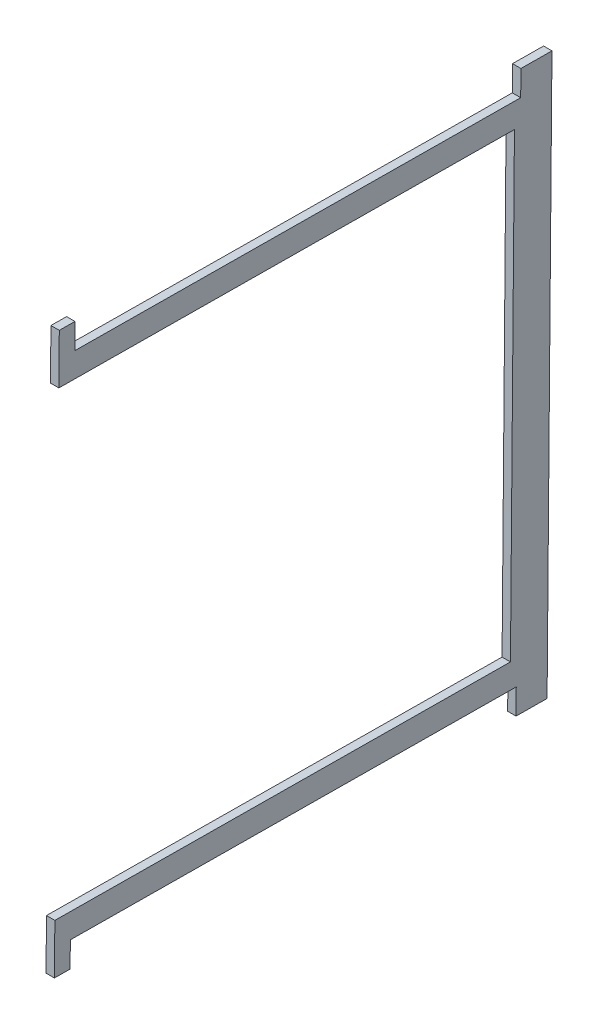
ISO-10303-21;
HEADER;
FILE_DESCRIPTION(('STEP AP214'),'2;1');
FILE_NAME('part.step','',(''),(''),'','','');
FILE_SCHEMA(('AUTOMOTIVE_DESIGN { 1 0 10303 214 1 1 1 1 }'));
ENDSEC;
DATA;
#1=APPLICATION_CONTEXT('core data for automotive mechanical design processes');
#2=APPLICATION_PROTOCOL_DEFINITION('international standard','automotive_design',2000,#1);
#3=PRODUCT_CONTEXT('',#1,'mechanical');
#4=PRODUCT('Part','Part','',(#3));
#5=PRODUCT_RELATED_PRODUCT_CATEGORY('part','',(#4));
#6=PRODUCT_DEFINITION_FORMATION('','',#4);
#7=PRODUCT_DEFINITION_CONTEXT('part definition',#1,'design');
#8=PRODUCT_DEFINITION('design','',#6,#7);
#9=PRODUCT_DEFINITION_SHAPE('','',#8);
#10=(LENGTH_UNIT() NAMED_UNIT(*) SI_UNIT(.MILLI.,.METRE.));
#11=(NAMED_UNIT(*) PLANE_ANGLE_UNIT() SI_UNIT($,.RADIAN.));
#12=(NAMED_UNIT(*) SI_UNIT($,.STERADIAN.) SOLID_ANGLE_UNIT());
#13=UNCERTAINTY_MEASURE_WITH_UNIT(LENGTH_MEASURE(1.E-05),#10,'distance_accuracy_value','');
#14=(GEOMETRIC_REPRESENTATION_CONTEXT(3) GLOBAL_UNCERTAINTY_ASSIGNED_CONTEXT((#13)) GLOBAL_UNIT_ASSIGNED_CONTEXT((#10,
#11,#12)) REPRESENTATION_CONTEXT('',''));
#15=CARTESIAN_POINT('',(0.,0.,0.));
#16=DIRECTION('',(0.,0.,1.));
#17=DIRECTION('',(1.,0.,0.));
#18=AXIS2_PLACEMENT_3D('',#15,#16,#17);
#19=CARTESIAN_POINT('',(445.899457677506,482.977062337016,968.367053666443));
#20=DIRECTION('',(0.,-0.999961923064171,0.00872653549836428));
#21=DIRECTION('',(0.,-0.00872653549836428,-0.999961923064171));
#22=AXIS2_PLACEMENT_3D('',#19,#20,#21);
#23=PLANE('',#22);
#24=DIRECTION('',(0.,-0.00872653549836428,-0.999961923064171));
#25=VECTOR('',#24,1.);
#26=CARTESIAN_POINT('',(453.543651110175,482.977062337016,968.367053666443));
#27=LINE('',#26,#25);
#28=CARTESIAN_POINT('',(453.543651110175,482.977062337016,968.367053666443));
#29=VERTEX_POINT('',#28);
#30=CARTESIAN_POINT('',(453.543651110175,482.852084673298,954.04603188463));
#31=VERTEX_POINT('',#30);
#32=EDGE_CURVE('E160',#29,#31,#27,.T.);
#33=ORIENTED_EDGE('',*,*,#32,.F.);
#34=DIRECTION('',(1.,0.,0.));
#35=VECTOR('',#34,1.);
#36=CARTESIAN_POINT('',(445.899457677506,482.977062337016,968.367053666443));
#37=LINE('',#36,#35);
#38=CARTESIAN_POINT('',(445.899457677506,482.977062337016,968.367053666443));
#39=VERTEX_POINT('',#38);
#40=EDGE_CURVE('E32',#39,#29,#37,.T.);
#41=ORIENTED_EDGE('',*,*,#40,.F.);
#42=DIRECTION('',(0.,-0.00872653549836428,-0.999961923064171));
#43=VECTOR('',#42,1.);
#44=CARTESIAN_POINT('',(445.899457677506,482.977062337016,968.367053666443));
#45=LINE('',#44,#43);
#46=CARTESIAN_POINT('',(445.899457677506,482.852084673298,954.04603188463));
#47=VERTEX_POINT('',#46);
#48=EDGE_CURVE('E204',#39,#47,#45,.T.);
#49=ORIENTED_EDGE('',*,*,#48,.T.);
#50=DIRECTION('',(1.,0.,0.));
#51=VECTOR('',#50,1.);
#52=CARTESIAN_POINT('',(445.899457677506,482.852084673298,954.04603188463));
#53=LINE('',#52,#51);
#54=EDGE_CURVE('E10',#47,#31,#53,.T.);
#55=ORIENTED_EDGE('',*,*,#54,.T.);
#56=EDGE_LOOP('',(#33,#41,#49,#55));
#57=FACE_BOUND('',#56,.T.);
#58=ADVANCED_FACE('F16',(#57),#23,.T.);
#59=CARTESIAN_POINT('',(445.899457677506,482.852084673298,954.04603188463));
#60=DIRECTION('',(0.,-0.00872653549836412,-0.999961923064171));
#61=DIRECTION('',(0.,0.999961923064171,-0.00872653549836412));
#62=AXIS2_PLACEMENT_3D('',#59,#60,#61);
#63=PLANE('',#62);
#64=DIRECTION('',(0.,0.999961923064171,-0.00872653549836412));
#65=VECTOR('',#64,1.);
#66=CARTESIAN_POINT('',(453.543651110175,482.852084673298,954.04603188463));
#67=LINE('',#66,#65);
#68=CARTESIAN_POINT('',(453.543651110175,505.851208903773,953.845321568167));
#69=VERTEX_POINT('',#68);
#70=EDGE_CURVE('E163',#31,#69,#67,.T.);
#71=ORIENTED_EDGE('',*,*,#70,.F.);
#72=ORIENTED_EDGE('',*,*,#54,.F.);
#73=DIRECTION('',(0.,0.999961923064171,-0.00872653549836412));
#74=VECTOR('',#73,1.);
#75=CARTESIAN_POINT('',(445.899457677506,482.852084673298,954.04603188463));
#76=LINE('',#75,#74);
#77=CARTESIAN_POINT('',(445.899457677506,505.851208903773,953.845321568167));
#78=VERTEX_POINT('',#77);
#79=EDGE_CURVE('E229',#47,#78,#76,.T.);
#80=ORIENTED_EDGE('',*,*,#79,.T.);
#81=DIRECTION('',(1.,0.,0.));
#82=VECTOR('',#81,1.);
#83=CARTESIAN_POINT('',(445.899457677506,505.851208903773,953.845321568167));
#84=LINE('',#83,#82);
#85=EDGE_CURVE('E24',#78,#69,#84,.T.);
#86=ORIENTED_EDGE('',*,*,#85,.T.);
#87=EDGE_LOOP('',(#71,#72,#80,#86));
#88=FACE_BOUND('',#87,.T.);
#89=ADVANCED_FACE('F228',(#88),#63,.T.);
#90=CARTESIAN_POINT('',(445.899457677506,505.851208903773,953.845321568167));
#91=DIRECTION('',(0.,-0.999961923064171,0.00872653549836412));
#92=DIRECTION('',(0.,-0.00872653549836412,-0.999961923064171));
#93=AXIS2_PLACEMENT_3D('',#90,#91,#92);
#94=PLANE('',#93);
#95=DIRECTION('',(0.,-0.00872653549836412,-0.999961923064171));
#96=VECTOR('',#95,1.);
#97=CARTESIAN_POINT('',(453.543651110175,505.851208903773,953.845321568167));
#98=LINE('',#97,#96);
#99=CARTESIAN_POINT('',(453.543651110175,502.30231512268,547.182373739965));
#100=VERTEX_POINT('',#99);
#101=EDGE_CURVE('E166',#69,#100,#98,.T.);
#102=ORIENTED_EDGE('',*,*,#101,.F.);
#103=ORIENTED_EDGE('',*,*,#85,.F.);
#104=DIRECTION('',(0.,-0.00872653549836412,-0.999961923064171));
#105=VECTOR('',#104,1.);
#106=CARTESIAN_POINT('',(445.899457677506,505.851208903773,953.845321568167));
#107=LINE('',#106,#105);
#108=CARTESIAN_POINT('',(445.899457677506,502.30231512268,547.182373739965));
#109=VERTEX_POINT('',#108);
#110=EDGE_CURVE('E238',#78,#109,#107,.T.);
#111=ORIENTED_EDGE('',*,*,#110,.T.);
#112=DIRECTION('',(1.,0.,0.));
#113=VECTOR('',#112,1.);
#114=CARTESIAN_POINT('',(445.899457677506,502.30231512268,547.182373739965));
#115=LINE('',#114,#113);
#116=EDGE_CURVE('E226',#109,#100,#115,.T.);
#117=ORIENTED_EDGE('',*,*,#116,.T.);
#118=EDGE_LOOP('',(#102,#103,#111,#117));
#119=FACE_BOUND('',#118,.T.);
#120=ADVANCED_FACE('F233',(#119),#94,.T.);
#121=CARTESIAN_POINT('',(445.899457677506,502.30231512268,547.182373739965));
#122=DIRECTION('',(0.,0.00872653549836412,0.999961923064171));
#123=DIRECTION('',(0.,-0.999961923064171,0.00872653549836412));
#124=AXIS2_PLACEMENT_3D('',#121,#122,#123);
#125=PLANE('',#124);
#126=DIRECTION('',(0.,-0.999961923064171,0.00872653549836412));
#127=VECTOR('',#126,1.);
#128=CARTESIAN_POINT('',(453.543651110175,502.30231512268,547.182373739965));
#129=LINE('',#128,#127);
#130=CARTESIAN_POINT('',(453.543651110175,479.303190892204,547.383084056429));
#131=VERTEX_POINT('',#130);
#132=EDGE_CURVE('E169',#100,#131,#129,.T.);
#133=ORIENTED_EDGE('',*,*,#132,.F.);
#134=ORIENTED_EDGE('',*,*,#116,.F.);
#135=DIRECTION('',(0.,-0.999961923064171,0.00872653549836412));
#136=VECTOR('',#135,1.);
#137=CARTESIAN_POINT('',(445.899457677506,502.30231512268,547.182373739965));
#138=LINE('',#137,#136);
#139=CARTESIAN_POINT('',(445.899457677506,479.303190892204,547.383084056429));
#140=VERTEX_POINT('',#139);
#141=EDGE_CURVE('E242',#109,#140,#138,.T.);
#142=ORIENTED_EDGE('',*,*,#141,.T.);
#143=DIRECTION('',(1.,0.,0.));
#144=VECTOR('',#143,1.);
#145=CARTESIAN_POINT('',(445.899457677506,479.303190892204,547.383084056429));
#146=LINE('',#145,#144);
#147=EDGE_CURVE('E224',#140,#131,#146,.T.);
#148=ORIENTED_EDGE('',*,*,#147,.T.);
#149=EDGE_LOOP('',(#133,#134,#142,#148));
#150=FACE_BOUND('',#149,.T.);
#151=ADVANCED_FACE('F305',(#150),#125,.T.);
#152=CARTESIAN_POINT('',(445.899457677506,479.303190892204,547.383084056429));
#153=DIRECTION('',(0.,-0.999961923064171,0.00872653549836381));
#154=DIRECTION('',(0.,-0.00872653549836381,-0.999961923064171));
#155=AXIS2_PLACEMENT_3D('',#152,#153,#154);
#156=PLANE('',#155);
#157=DIRECTION('',(0.,-0.00872653549836381,-0.999961923064171));
#158=VECTOR('',#157,1.);
#159=CARTESIAN_POINT('',(453.543651110175,479.303190892204,547.383084056429));
#160=LINE('',#159,#158);
#161=CARTESIAN_POINT('',(453.543651110175,479.056041731509,519.062595351715));
#162=VERTEX_POINT('',#161);
#163=EDGE_CURVE('E172',#131,#162,#160,.T.);
#164=ORIENTED_EDGE('',*,*,#163,.F.);
#165=ORIENTED_EDGE('',*,*,#147,.F.);
#166=DIRECTION('',(0.,-0.00872653549836381,-0.999961923064171));
#167=VECTOR('',#166,1.);
#168=CARTESIAN_POINT('',(445.899457677506,479.303190892204,547.383084056429));
#169=LINE('',#168,#167);
#170=CARTESIAN_POINT('',(445.899457677506,479.056041731509,519.062595351715));
#171=VERTEX_POINT('',#170);
#172=EDGE_CURVE('E245',#140,#171,#169,.T.);
#173=ORIENTED_EDGE('',*,*,#172,.T.);
#174=DIRECTION('',(1.,0.,0.));
#175=VECTOR('',#174,1.);
#176=CARTESIAN_POINT('',(445.899457677506,479.056041731509,519.062595351715));
#177=LINE('',#176,#175);
#178=EDGE_CURVE('E222',#171,#162,#177,.T.);
#179=ORIENTED_EDGE('',*,*,#178,.T.);
#180=EDGE_LOOP('',(#164,#165,#173,#179));
#181=FACE_BOUND('',#180,.T.);
#182=ADVANCED_FACE('F303',(#181),#156,.T.);
#183=CARTESIAN_POINT('',(445.899457677506,479.056041731509,519.062595351715));
#184=DIRECTION('',(0.,-0.0087265354983643,-0.999961923064171));
#185=DIRECTION('',(0.,0.999961923064172,-0.0087265354983643));
#186=AXIS2_PLACEMENT_3D('',#183,#184,#185);
#187=PLANE('',#186);
#188=DIRECTION('',(0.,0.999961923064172,-0.0087265354983643));
#189=VECTOR('',#188,1.);
#190=CARTESIAN_POINT('',(453.543651110175,479.056041731509,519.062595351715));
#191=LINE('',#190,#189);
#192=CARTESIAN_POINT('',(453.543651110175,988.358215430088,514.617982616307));
#193=VERTEX_POINT('',#192);
#194=EDGE_CURVE('E175',#162,#193,#191,.T.);
#195=ORIENTED_EDGE('',*,*,#194,.F.);
#196=ORIENTED_EDGE('',*,*,#178,.F.);
#197=DIRECTION('',(0.,0.999961923064172,-0.0087265354983643));
#198=VECTOR('',#197,1.);
#199=CARTESIAN_POINT('',(445.899457677506,479.056041731509,519.062595351715));
#200=LINE('',#199,#198);
#201=CARTESIAN_POINT('',(445.899457677506,988.358215430088,514.617982616307));
#202=VERTEX_POINT('',#201);
#203=EDGE_CURVE('E248',#171,#202,#200,.T.);
#204=ORIENTED_EDGE('',*,*,#203,.T.);
#205=DIRECTION('',(1.,0.,0.));
#206=VECTOR('',#205,1.);
#207=CARTESIAN_POINT('',(445.899457677506,988.358215430088,514.617982616307));
#208=LINE('',#207,#206);
#209=EDGE_CURVE('E220',#202,#193,#208,.T.);
#210=ORIENTED_EDGE('',*,*,#209,.T.);
#211=EDGE_LOOP('',(#195,#196,#204,#210));
#212=FACE_BOUND('',#211,.T.);
#213=ADVANCED_FACE('F300',(#212),#187,.T.);
#214=CARTESIAN_POINT('',(445.899457677506,988.358215430088,514.617982616307));
#215=DIRECTION('',(0.,0.999961923064171,-0.00872653549836415));
#216=DIRECTION('',(0.,0.00872653549836415,0.999961923064172));
#217=AXIS2_PLACEMENT_3D('',#214,#215,#216);
#218=PLANE('',#217);
#219=DIRECTION('',(0.,0.00872653549836415,0.999961923064172));
#220=VECTOR('',#219,1.);
#221=CARTESIAN_POINT('',(453.543651110175,988.358215430088,514.617982616307));
#222=LINE('',#221,#220);
#223=CARTESIAN_POINT('',(453.543651110175,988.605364590784,542.938471321019));
#224=VERTEX_POINT('',#223);
#225=EDGE_CURVE('E178',#193,#224,#222,.T.);
#226=ORIENTED_EDGE('',*,*,#225,.F.);
#227=ORIENTED_EDGE('',*,*,#209,.F.);
#228=DIRECTION('',(0.,0.00872653549836415,0.999961923064172));
#229=VECTOR('',#228,1.);
#230=CARTESIAN_POINT('',(445.899457677506,988.358215430088,514.617982616307));
#231=LINE('',#230,#229);
#232=CARTESIAN_POINT('',(445.899457677506,988.605364590784,542.938471321019));
#233=VERTEX_POINT('',#232);
#234=EDGE_CURVE('E251',#202,#233,#231,.T.);
#235=ORIENTED_EDGE('',*,*,#234,.T.);
#236=DIRECTION('',(1.,0.,0.));
#237=VECTOR('',#236,1.);
#238=CARTESIAN_POINT('',(445.899457677506,988.605364590784,542.938471321019));
#239=LINE('',#238,#237);
#240=EDGE_CURVE('E218',#233,#224,#239,.T.);
#241=ORIENTED_EDGE('',*,*,#240,.T.);
#242=EDGE_LOOP('',(#226,#227,#235,#241));
#243=FACE_BOUND('',#242,.T.);
#244=ADVANCED_FACE('F294',(#243),#218,.T.);
#245=CARTESIAN_POINT('',(445.899457677506,988.605364590784,542.938471321019));
#246=DIRECTION('',(0.,0.00872653549836412,0.999961923064171));
#247=DIRECTION('',(0.,-0.999961923064171,0.00872653549836412));
#248=AXIS2_PLACEMENT_3D('',#245,#246,#247);
#249=PLANE('',#248);
#250=DIRECTION('',(0.,-0.999961923064171,0.00872653549836412));
#251=VECTOR('',#250,1.);
#252=CARTESIAN_POINT('',(453.543651110175,988.605364590784,542.938471321019));
#253=LINE('',#252,#251);
#254=CARTESIAN_POINT('',(453.543651110175,965.606240360308,543.139181637481));
#255=VERTEX_POINT('',#254);
#256=EDGE_CURVE('E181',#224,#255,#253,.T.);
#257=ORIENTED_EDGE('',*,*,#256,.F.);
#258=ORIENTED_EDGE('',*,*,#240,.F.);
#259=DIRECTION('',(0.,-0.999961923064171,0.00872653549836412));
#260=VECTOR('',#259,1.);
#261=CARTESIAN_POINT('',(445.899457677506,988.605364590784,542.938471321019));
#262=LINE('',#261,#260);
#263=CARTESIAN_POINT('',(445.899457677506,965.606240360308,543.139181637481));
#264=VERTEX_POINT('',#263);
#265=EDGE_CURVE('E254',#233,#264,#262,.T.);
#266=ORIENTED_EDGE('',*,*,#265,.T.);
#267=DIRECTION('',(1.,0.,0.));
#268=VECTOR('',#267,1.);
#269=CARTESIAN_POINT('',(445.899457677506,965.606240360308,543.139181637481));
#270=LINE('',#269,#268);
#271=EDGE_CURVE('E216',#264,#255,#270,.T.);
#272=ORIENTED_EDGE('',*,*,#271,.T.);
#273=EDGE_LOOP('',(#257,#258,#266,#272));
#274=FACE_BOUND('',#273,.T.);
#275=ADVANCED_FACE('F291',(#274),#249,.T.);
#276=CARTESIAN_POINT('',(445.899457677506,965.606240360308,543.139181637481));
#277=DIRECTION('',(0.,0.999961923064171,-0.00872653549836412));
#278=DIRECTION('',(0.,0.00872653549836412,0.999961923064171));
#279=AXIS2_PLACEMENT_3D('',#276,#277,#278);
#280=PLANE('',#279);
#281=DIRECTION('',(0.,0.00872653549836412,0.999961923064171));
#282=VECTOR('',#281,1.);
#283=CARTESIAN_POINT('',(453.543651110175,965.606240360308,543.139181637481));
#284=LINE('',#283,#282);
#285=CARTESIAN_POINT('',(453.543651110175,969.155134141401,949.802129465683));
#286=VERTEX_POINT('',#285);
#287=EDGE_CURVE('E184',#255,#286,#284,.T.);
#288=ORIENTED_EDGE('',*,*,#287,.F.);
#289=ORIENTED_EDGE('',*,*,#271,.F.);
#290=DIRECTION('',(0.,0.00872653549836412,0.999961923064171));
#291=VECTOR('',#290,1.);
#292=CARTESIAN_POINT('',(445.899457677506,965.606240360308,543.139181637481));
#293=LINE('',#292,#291);
#294=CARTESIAN_POINT('',(445.899457677506,969.155134141401,949.802129465683));
#295=VERTEX_POINT('',#294);
#296=EDGE_CURVE('E257',#264,#295,#293,.T.);
#297=ORIENTED_EDGE('',*,*,#296,.T.);
#298=DIRECTION('',(1.,0.,0.));
#299=VECTOR('',#298,1.);
#300=CARTESIAN_POINT('',(445.899457677506,969.155134141401,949.802129465683));
#301=LINE('',#300,#299);
#302=EDGE_CURVE('E214',#295,#286,#301,.T.);
#303=ORIENTED_EDGE('',*,*,#302,.T.);
#304=EDGE_LOOP('',(#288,#289,#297,#303));
#305=FACE_BOUND('',#304,.T.);
#306=ADVANCED_FACE('F288',(#305),#280,.T.);
#307=CARTESIAN_POINT('',(445.899457677506,969.155134141401,949.802129465683));
#308=DIRECTION('',(0.,-0.00872653549836412,-0.999961923064171));
#309=DIRECTION('',(0.,0.999961923064171,-0.00872653549836412));
#310=AXIS2_PLACEMENT_3D('',#307,#308,#309);
#311=PLANE('',#310);
#312=DIRECTION('',(0.,0.999961923064171,-0.00872653549836412));
#313=VECTOR('',#312,1.);
#314=CARTESIAN_POINT('',(453.543651110175,969.155134141401,949.802129465683));
#315=LINE('',#314,#313);
#316=CARTESIAN_POINT('',(453.543651110175,992.154258371876,949.601419149221));
#317=VERTEX_POINT('',#316);
#318=EDGE_CURVE('E187',#286,#317,#315,.T.);
#319=ORIENTED_EDGE('',*,*,#318,.F.);
#320=ORIENTED_EDGE('',*,*,#302,.F.);
#321=DIRECTION('',(0.,0.999961923064171,-0.00872653549836412));
#322=VECTOR('',#321,1.);
#323=CARTESIAN_POINT('',(445.899457677506,969.155134141401,949.802129465683));
#324=LINE('',#323,#322);
#325=CARTESIAN_POINT('',(445.899457677506,992.154258371876,949.601419149221));
#326=VERTEX_POINT('',#325);
#327=EDGE_CURVE('E260',#295,#326,#324,.T.);
#328=ORIENTED_EDGE('',*,*,#327,.T.);
#329=DIRECTION('',(1.,0.,0.));
#330=VECTOR('',#329,1.);
#331=CARTESIAN_POINT('',(445.899457677506,992.154258371876,949.601419149221));
#332=LINE('',#331,#330);
#333=EDGE_CURVE('E212',#326,#317,#332,.T.);
#334=ORIENTED_EDGE('',*,*,#333,.T.);
#335=EDGE_LOOP('',(#319,#320,#328,#334));
#336=FACE_BOUND('',#335,.T.);
#337=ADVANCED_FACE('F282',(#336),#311,.T.);
#338=CARTESIAN_POINT('',(445.899457677506,992.154258371876,949.601419149221));
#339=DIRECTION('',(0.,0.999961923064171,-0.00872653549836402));
#340=DIRECTION('',(0.,0.00872653549836402,0.999961923064171));
#341=AXIS2_PLACEMENT_3D('',#338,#339,#340);
#342=PLANE('',#341);
#343=DIRECTION('',(0.,0.00872653549836402,0.999961923064171));
#344=VECTOR('',#343,1.);
#345=CARTESIAN_POINT('',(453.543651110175,992.154258371876,949.601419149221));
#346=LINE('',#345,#344);
#347=CARTESIAN_POINT('',(453.543651110175,992.279236035595,963.922440931035));
#348=VERTEX_POINT('',#347);
#349=EDGE_CURVE('E190',#317,#348,#346,.T.);
#350=ORIENTED_EDGE('',*,*,#349,.F.);
#351=ORIENTED_EDGE('',*,*,#333,.F.);
#352=DIRECTION('',(0.,0.00872653549836402,0.999961923064171));
#353=VECTOR('',#352,1.);
#354=CARTESIAN_POINT('',(445.899457677506,992.154258371876,949.601419149221));
#355=LINE('',#354,#353);
#356=CARTESIAN_POINT('',(445.899457677506,992.279236035595,963.922440931035));
#357=VERTEX_POINT('',#356);
#358=EDGE_CURVE('E263',#326,#357,#355,.T.);
#359=ORIENTED_EDGE('',*,*,#358,.T.);
#360=DIRECTION('',(1.,0.,0.));
#361=VECTOR('',#360,1.);
#362=CARTESIAN_POINT('',(445.899457677506,992.279236035595,963.922440931035));
#363=LINE('',#362,#361);
#364=EDGE_CURVE('E210',#357,#348,#363,.T.);
#365=ORIENTED_EDGE('',*,*,#364,.T.);
#366=EDGE_LOOP('',(#350,#351,#359,#365));
#367=FACE_BOUND('',#366,.T.);
#368=ADVANCED_FACE('F279',(#367),#342,.T.);
#369=CARTESIAN_POINT('',(445.899457677506,992.279236035595,963.922440931035));
#370=DIRECTION('',(0.,0.00872653549836404,0.999961923064171));
#371=DIRECTION('',(0.,-0.999961923064171,0.00872653549836404));
#372=AXIS2_PLACEMENT_3D('',#369,#370,#371);
#373=PLANE('',#372);
#374=DIRECTION('',(0.,-0.999961923064171,0.00872653549836404));
#375=VECTOR('',#374,1.);
#376=CARTESIAN_POINT('',(453.543651110175,992.279236035595,963.922440931035));
#377=LINE('',#376,#375);
#378=CARTESIAN_POINT('',(453.543651110175,946.959394638791,964.317941195202));
#379=VERTEX_POINT('',#378);
#380=EDGE_CURVE('E193',#348,#379,#377,.T.);
#381=ORIENTED_EDGE('',*,*,#380,.F.);
#382=ORIENTED_EDGE('',*,*,#364,.F.);
#383=DIRECTION('',(0.,-0.999961923064171,0.00872653549836404));
#384=VECTOR('',#383,1.);
#385=CARTESIAN_POINT('',(445.899457677506,992.279236035595,963.922440931035));
#386=LINE('',#385,#384);
#387=CARTESIAN_POINT('',(445.899457677506,946.959394638791,964.317941195202));
#388=VERTEX_POINT('',#387);
#389=EDGE_CURVE('E266',#357,#388,#386,.T.);
#390=ORIENTED_EDGE('',*,*,#389,.T.);
#391=DIRECTION('',(1.,0.,0.));
#392=VECTOR('',#391,1.);
#393=CARTESIAN_POINT('',(445.899457677506,946.959394638791,964.317941195202));
#394=LINE('',#393,#392);
#395=EDGE_CURVE('E208',#388,#379,#394,.T.);
#396=ORIENTED_EDGE('',*,*,#395,.T.);
#397=EDGE_LOOP('',(#381,#382,#390,#396));
#398=FACE_BOUND('',#397,.T.);
#399=ADVANCED_FACE('F276',(#398),#373,.T.);
#400=CARTESIAN_POINT('',(445.899457677506,946.959394638791,964.317941195202));
#401=DIRECTION('',(0.,-0.999961923064171,0.008726535498364));
#402=DIRECTION('',(0.,-0.008726535498364,-0.999961923064171));
#403=AXIS2_PLACEMENT_3D('',#400,#401,#402);
#404=PLANE('',#403);
#405=DIRECTION('',(0.,-0.008726535498364,-0.999961923064171));
#406=VECTOR('',#405,1.);
#407=CARTESIAN_POINT('',(453.543651110175,946.959394638791,964.317941195202));
#408=LINE('',#407,#406);
#409=CARTESIAN_POINT('',(453.543651110175,943.333519139221,548.833762162039));
#410=VERTEX_POINT('',#409);
#411=EDGE_CURVE('E196',#379,#410,#408,.T.);
#412=ORIENTED_EDGE('',*,*,#411,.F.);
#413=ORIENTED_EDGE('',*,*,#395,.F.);
#414=DIRECTION('',(0.,-0.008726535498364,-0.999961923064171));
#415=VECTOR('',#414,1.);
#416=CARTESIAN_POINT('',(445.899457677506,946.959394638791,964.317941195202));
#417=LINE('',#416,#415);
#418=CARTESIAN_POINT('',(445.899457677506,943.333519139221,548.833762162039));
#419=VERTEX_POINT('',#418);
#420=EDGE_CURVE('E151',#388,#419,#417,.T.);
#421=ORIENTED_EDGE('',*,*,#420,.T.);
#422=DIRECTION('',(1.,0.,0.));
#423=VECTOR('',#422,1.);
#424=CARTESIAN_POINT('',(445.899457677506,943.333519139221,548.833762162039));
#425=LINE('',#424,#423);
#426=EDGE_CURVE('E143',#419,#410,#425,.T.);
#427=ORIENTED_EDGE('',*,*,#426,.T.);
#428=EDGE_LOOP('',(#412,#413,#421,#427));
#429=FACE_BOUND('',#428,.T.);
#430=ADVANCED_FACE('F270',(#429),#404,.T.);
#431=CARTESIAN_POINT('',(445.899457677506,943.333519139221,548.833762162039));
#432=DIRECTION('',(0.,0.008726535498364,0.999961923064171));
#433=DIRECTION('',(0.,-0.999961923064171,0.008726535498364));
#434=AXIS2_PLACEMENT_3D('',#431,#432,#433);
#435=PLANE('',#434);
#436=DIRECTION('',(0.,-0.999961923064171,0.008726535498364));
#437=VECTOR('',#436,1.);
#438=CARTESIAN_POINT('',(453.543651110175,943.333519139221,548.833762162039));
#439=LINE('',#438,#437);
#440=CARTESIAN_POINT('',(453.543651110175,524.671028234248,552.487374369113));
#441=VERTEX_POINT('',#440);
#442=EDGE_CURVE('E199',#410,#441,#439,.T.);
#443=ORIENTED_EDGE('',*,*,#442,.F.);
#444=ORIENTED_EDGE('',*,*,#426,.F.);
#445=DIRECTION('',(0.,-0.999961923064171,0.008726535498364));
#446=VECTOR('',#445,1.);
#447=CARTESIAN_POINT('',(445.899457677506,943.333519139221,548.833762162039));
#448=LINE('',#447,#446);
#449=CARTESIAN_POINT('',(445.899457677506,524.671028234248,552.487374369113));
#450=VERTEX_POINT('',#449);
#451=EDGE_CURVE('E146',#419,#450,#448,.T.);
#452=ORIENTED_EDGE('',*,*,#451,.T.);
#453=DIRECTION('',(1.,0.,0.));
#454=VECTOR('',#453,1.);
#455=CARTESIAN_POINT('',(445.899457677506,524.671028234248,552.487374369113));
#456=LINE('',#455,#454);
#457=EDGE_CURVE('E132',#450,#441,#456,.T.);
#458=ORIENTED_EDGE('',*,*,#457,.T.);
#459=EDGE_LOOP('',(#443,#444,#452,#458));
#460=FACE_BOUND('',#459,.T.);
#461=ADVANCED_FACE('F147',(#460),#435,.T.);
#462=CARTESIAN_POINT('',(445.899457677506,524.671028234248,552.487374369113));
#463=DIRECTION('',(0.,0.999961923064171,-0.008726535498364));
#464=DIRECTION('',(0.,0.008726535498364,0.999961923064171));
#465=AXIS2_PLACEMENT_3D('',#462,#463,#464);
#466=PLANE('',#465);
#467=DIRECTION('',(0.,0.008726535498364,0.999961923064171));
#468=VECTOR('',#467,1.);
#469=CARTESIAN_POINT('',(453.543651110175,524.671028234248,552.487374369113));
#470=LINE('',#469,#468);
#471=CARTESIAN_POINT('',(453.543651110175,528.296903733818,967.971553402275));
#472=VERTEX_POINT('',#471);
#473=EDGE_CURVE('E139',#441,#472,#470,.T.);
#474=ORIENTED_EDGE('',*,*,#473,.F.);
#475=ORIENTED_EDGE('',*,*,#457,.F.);
#476=DIRECTION('',(0.,0.008726535498364,0.999961923064171));
#477=VECTOR('',#476,1.);
#478=CARTESIAN_POINT('',(445.899457677506,524.671028234248,552.487374369113));
#479=LINE('',#478,#477);
#480=CARTESIAN_POINT('',(445.899457677506,528.296903733818,967.971553402275));
#481=VERTEX_POINT('',#480);
#482=EDGE_CURVE('E136',#450,#481,#479,.T.);
#483=ORIENTED_EDGE('',*,*,#482,.T.);
#484=DIRECTION('',(1.,0.,0.));
#485=VECTOR('',#484,1.);
#486=CARTESIAN_POINT('',(445.899457677506,528.296903733818,967.971553402275));
#487=LINE('',#486,#485);
#488=EDGE_CURVE('E84',#481,#472,#487,.T.);
#489=ORIENTED_EDGE('',*,*,#488,.T.);
#490=EDGE_LOOP('',(#474,#475,#483,#489));
#491=FACE_BOUND('',#490,.T.);
#492=ADVANCED_FACE('F134',(#491),#466,.T.);
#493=CARTESIAN_POINT('',(445.899457677506,528.296903733818,967.971553402275));
#494=DIRECTION('',(0.,0.00872653549836428,0.999961923064171));
#495=DIRECTION('',(0.,-0.999961923064171,0.00872653549836428));
#496=AXIS2_PLACEMENT_3D('',#493,#494,#495);
#497=PLANE('',#496);
#498=DIRECTION('',(0.,-0.999961923064171,0.00872653549836428));
#499=VECTOR('',#498,1.);
#500=CARTESIAN_POINT('',(453.543651110175,528.296903733818,967.971553402275));
#501=LINE('',#500,#499);
#502=EDGE_CURVE('E202',#472,#29,#501,.T.);
#503=ORIENTED_EDGE('',*,*,#502,.F.);
#504=ORIENTED_EDGE('',*,*,#488,.F.);
#505=DIRECTION('',(0.,-0.999961923064171,0.00872653549836428));
#506=VECTOR('',#505,1.);
#507=CARTESIAN_POINT('',(445.899457677506,528.296903733818,967.971553402275));
#508=LINE('',#507,#506);
#509=EDGE_CURVE('E155',#481,#39,#508,.T.);
#510=ORIENTED_EDGE('',*,*,#509,.T.);
#511=ORIENTED_EDGE('',*,*,#40,.T.);
#512=EDGE_LOOP('',(#503,#504,#510,#511));
#513=FACE_BOUND('',#512,.T.);
#514=ADVANCED_FACE('F421',(#513),#497,.T.);
#515=CARTESIAN_POINT('',(445.899457677506,735.829079790271,759.991813718062));
#516=DIRECTION('',(1.,0.,0.));
#517=DIRECTION('',(0.,1.,0.));
#518=AXIS2_PLACEMENT_3D('',#515,#516,#517);
#519=PLANE('',#518);
#520=ORIENTED_EDGE('',*,*,#48,.F.);
#521=ORIENTED_EDGE('',*,*,#509,.F.);
#522=ORIENTED_EDGE('',*,*,#482,.F.);
#523=ORIENTED_EDGE('',*,*,#451,.F.);
#524=ORIENTED_EDGE('',*,*,#420,.F.);
#525=ORIENTED_EDGE('',*,*,#389,.F.);
#526=ORIENTED_EDGE('',*,*,#358,.F.);
#527=ORIENTED_EDGE('',*,*,#327,.F.);
#528=ORIENTED_EDGE('',*,*,#296,.F.);
#529=ORIENTED_EDGE('',*,*,#265,.F.);
#530=ORIENTED_EDGE('',*,*,#234,.F.);
#531=ORIENTED_EDGE('',*,*,#203,.F.);
#532=ORIENTED_EDGE('',*,*,#172,.F.);
#533=ORIENTED_EDGE('',*,*,#141,.F.);
#534=ORIENTED_EDGE('',*,*,#110,.F.);
#535=ORIENTED_EDGE('',*,*,#79,.F.);
#536=EDGE_LOOP('',(#520,#521,#522,#523,#524,#525,#526,#527,#528,#529,#530,#531,#532,#533,#534,#535));
#537=FACE_BOUND('',#536,.T.);
#538=ADVANCED_FACE('F154',(#537),#519,.F.);
#539=CARTESIAN_POINT('',(453.543651110175,735.829079790271,759.991813718062));
#540=DIRECTION('',(1.,0.,0.));
#541=DIRECTION('',(0.,1.,0.));
#542=AXIS2_PLACEMENT_3D('',#539,#540,#541);
#543=PLANE('',#542);
#544=ORIENTED_EDGE('',*,*,#32,.T.);
#545=ORIENTED_EDGE('',*,*,#70,.T.);
#546=ORIENTED_EDGE('',*,*,#101,.T.);
#547=ORIENTED_EDGE('',*,*,#132,.T.);
#548=ORIENTED_EDGE('',*,*,#163,.T.);
#549=ORIENTED_EDGE('',*,*,#194,.T.);
#550=ORIENTED_EDGE('',*,*,#225,.T.);
#551=ORIENTED_EDGE('',*,*,#256,.T.);
#552=ORIENTED_EDGE('',*,*,#287,.T.);
#553=ORIENTED_EDGE('',*,*,#318,.T.);
#554=ORIENTED_EDGE('',*,*,#349,.T.);
#555=ORIENTED_EDGE('',*,*,#380,.T.);
#556=ORIENTED_EDGE('',*,*,#411,.T.);
#557=ORIENTED_EDGE('',*,*,#442,.T.);
#558=ORIENTED_EDGE('',*,*,#473,.T.);
#559=ORIENTED_EDGE('',*,*,#502,.T.);
#560=EDGE_LOOP('',(#544,#545,#546,#547,#548,#549,#550,#551,#552,#553,#554,#555,#556,#557,#558,#559));
#561=FACE_BOUND('',#560,.T.);
#562=ADVANCED_FACE('F236',(#561),#543,.T.);
#563=CLOSED_SHELL('',(#58,#89,#120,#151,#182,#213,#244,#275,#306,#337,#368,#399,#430,#461,#492,
#514,#538,#562));
#564=MANIFOLD_SOLID_BREP('B1',#563);
#565=ADVANCED_BREP_SHAPE_REPRESENTATION('',(#18,#564),#14);
#566=SHAPE_DEFINITION_REPRESENTATION(#9,#565);
ENDSEC;
END-ISO-10303-21;
